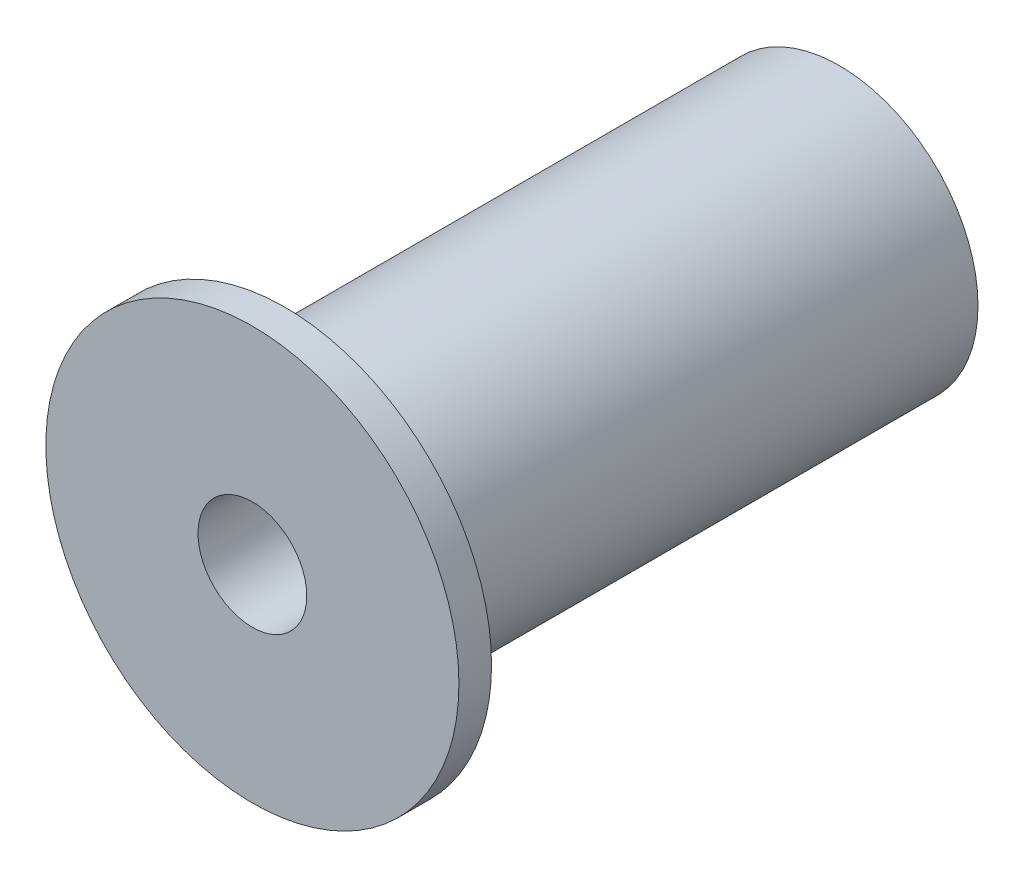
ISO-10303-21;
HEADER;
FILE_DESCRIPTION(('STEP AP214'),'2;1');
FILE_NAME('part.step','',(''),(''),'','','');
FILE_SCHEMA(('AUTOMOTIVE_DESIGN { 1 0 10303 214 1 1 1 1 }'));
ENDSEC;
DATA;
#1=APPLICATION_CONTEXT('core data for automotive mechanical design processes');
#2=APPLICATION_PROTOCOL_DEFINITION('international standard','automotive_design',2000,#1);
#3=PRODUCT_CONTEXT('',#1,'mechanical');
#4=PRODUCT('Part','Part','',(#3));
#5=PRODUCT_RELATED_PRODUCT_CATEGORY('part','',(#4));
#6=PRODUCT_DEFINITION_FORMATION('','',#4);
#7=PRODUCT_DEFINITION_CONTEXT('part definition',#1,'design');
#8=PRODUCT_DEFINITION('design','',#6,#7);
#9=PRODUCT_DEFINITION_SHAPE('','',#8);
#10=(LENGTH_UNIT() NAMED_UNIT(*) SI_UNIT(.MILLI.,.METRE.));
#11=(NAMED_UNIT(*) PLANE_ANGLE_UNIT() SI_UNIT($,.RADIAN.));
#12=(NAMED_UNIT(*) SI_UNIT($,.STERADIAN.) SOLID_ANGLE_UNIT());
#13=UNCERTAINTY_MEASURE_WITH_UNIT(LENGTH_MEASURE(1.E-05),#10,'distance_accuracy_value','');
#14=(GEOMETRIC_REPRESENTATION_CONTEXT(3) GLOBAL_UNCERTAINTY_ASSIGNED_CONTEXT((#13)) GLOBAL_UNIT_ASSIGNED_CONTEXT((#10,
#11,#12)) REPRESENTATION_CONTEXT('',''));
#15=CARTESIAN_POINT('',(0.,0.,0.));
#16=DIRECTION('',(0.,0.,1.));
#17=DIRECTION('',(1.,0.,0.));
#18=AXIS2_PLACEMENT_3D('',#15,#16,#17);
#19=CARTESIAN_POINT('',(0.,0.,0.));
#20=DIRECTION('',(0.,0.,1.));
#21=DIRECTION('',(1.,0.,0.));
#22=AXIS2_PLACEMENT_3D('',#19,#20,#21);
#23=PLANE('',#22);
#24=CARTESIAN_POINT('',(0.,0.,0.));
#25=DIRECTION('',(0.,0.,1.));
#26=DIRECTION('',(1.,0.,0.));
#27=AXIS2_PLACEMENT_3D('',#24,#25,#26);
#28=CIRCLE('',#27,9.5);
#29=CARTESIAN_POINT('',(9.5,0.,0.));
#30=VERTEX_POINT('',#29);
#31=EDGE_CURVE('E49',#30,#30,#28,.T.);
#32=ORIENTED_EDGE('',*,*,#31,.F.);
#33=EDGE_LOOP('',(#32));
#34=FACE_BOUND('',#33,.T.);
#35=CARTESIAN_POINT('',(0.,0.,0.));
#36=DIRECTION('',(0.,0.,1.));
#37=DIRECTION('',(1.,0.,0.));
#38=AXIS2_PLACEMENT_3D('',#35,#36,#37);
#39=CIRCLE('',#38,6.375);
#40=CARTESIAN_POINT('',(6.375,0.,0.));
#41=VERTEX_POINT('',#40);
#42=EDGE_CURVE('E42',#41,#41,#39,.F.);
#43=ORIENTED_EDGE('',*,*,#42,.F.);
#44=EDGE_LOOP('',(#43));
#45=FACE_BOUND('',#44,.T.);
#46=ADVANCED_FACE('F31',(#34,#45),#23,.F.);
#47=CARTESIAN_POINT('',(0.,0.,1.5));
#48=DIRECTION('',(0.,0.,-1.));
#49=DIRECTION('',(-1.,0.,0.));
#50=AXIS2_PLACEMENT_3D('',#47,#48,#49);
#51=CYLINDRICAL_SURFACE('',#50,9.5);
#52=CARTESIAN_POINT('',(0.,0.,1.5));
#53=DIRECTION('',(0.,0.,1.));
#54=DIRECTION('',(1.,0.,0.));
#55=AXIS2_PLACEMENT_3D('',#52,#53,#54);
#56=CIRCLE('',#55,9.5);
#57=CARTESIAN_POINT('',(9.5,0.,1.5));
#58=VERTEX_POINT('',#57);
#59=EDGE_CURVE('E46',#58,#58,#56,.T.);
#60=ORIENTED_EDGE('',*,*,#59,.F.);
#61=EDGE_LOOP('',(#60));
#62=FACE_BOUND('',#61,.T.);
#63=ORIENTED_EDGE('',*,*,#31,.T.);
#64=EDGE_LOOP('',(#63));
#65=FACE_BOUND('',#64,.T.);
#66=ADVANCED_FACE('F84',(#62,#65),#51,.T.);
#67=CARTESIAN_POINT('',(0.,0.,1.5));
#68=DIRECTION('',(0.,0.,1.));
#69=DIRECTION('',(1.,0.,0.));
#70=AXIS2_PLACEMENT_3D('',#67,#68,#69);
#71=PLANE('',#70);
#72=CARTESIAN_POINT('',(0.,0.,1.5));
#73=DIRECTION('',(0.,0.,1.));
#74=DIRECTION('',(1.,0.,0.));
#75=AXIS2_PLACEMENT_3D('',#72,#73,#74);
#76=CIRCLE('',#75,2.5);
#77=CARTESIAN_POINT('',(2.5,0.,1.5));
#78=VERTEX_POINT('',#77);
#79=EDGE_CURVE('E58',#78,#78,#76,.T.);
#80=ORIENTED_EDGE('',*,*,#79,.F.);
#81=EDGE_LOOP('',(#80));
#82=FACE_BOUND('',#81,.T.);
#83=ORIENTED_EDGE('',*,*,#59,.T.);
#84=EDGE_LOOP('',(#83));
#85=FACE_BOUND('',#84,.T.);
#86=ADVANCED_FACE('F79',(#82,#85),#71,.T.);
#87=CARTESIAN_POINT('',(0.,0.,-25.5));
#88=DIRECTION('',(0.,0.,1.));
#89=DIRECTION('',(1.,0.,0.));
#90=AXIS2_PLACEMENT_3D('',#87,#88,#89);
#91=CYLINDRICAL_SURFACE('',#90,6.375);
#92=CARTESIAN_POINT('',(0.,0.,-25.5));
#93=DIRECTION('',(0.,0.,-1.));
#94=DIRECTION('',(-1.,0.,0.));
#95=AXIS2_PLACEMENT_3D('',#92,#93,#94);
#96=CIRCLE('',#95,6.375);
#97=CARTESIAN_POINT('',(-6.375,0.,-25.5));
#98=VERTEX_POINT('',#97);
#99=EDGE_CURVE('E52',#98,#98,#96,.T.);
#100=ORIENTED_EDGE('',*,*,#99,.F.);
#101=EDGE_LOOP('',(#100));
#102=FACE_BOUND('',#101,.T.);
#103=ORIENTED_EDGE('',*,*,#42,.T.);
#104=EDGE_LOOP('',(#103));
#105=FACE_BOUND('',#104,.T.);
#106=ADVANCED_FACE('F73',(#102,#105),#91,.T.);
#107=CARTESIAN_POINT('',(0.,0.,-25.5));
#108=DIRECTION('',(0.,0.,-1.));
#109=DIRECTION('',(-1.,0.,0.));
#110=AXIS2_PLACEMENT_3D('',#107,#108,#109);
#111=PLANE('',#110);
#112=CARTESIAN_POINT('',(0.,0.,-25.5));
#113=DIRECTION('',(0.,0.,-1.));
#114=DIRECTION('',(-1.,0.,0.));
#115=AXIS2_PLACEMENT_3D('',#112,#113,#114);
#116=CIRCLE('',#115,1.5);
#117=CARTESIAN_POINT('',(-1.5,0.,-25.5));
#118=VERTEX_POINT('',#117);
#119=EDGE_CURVE('E61',#118,#118,#116,.T.);
#120=ORIENTED_EDGE('',*,*,#119,.F.);
#121=EDGE_LOOP('',(#120));
#122=FACE_BOUND('',#121,.T.);
#123=ORIENTED_EDGE('',*,*,#99,.T.);
#124=EDGE_LOOP('',(#123));
#125=FACE_BOUND('',#124,.T.);
#126=ADVANCED_FACE('F69',(#122,#125),#111,.T.);
#127=CARTESIAN_POINT('',(0.,0.,-11.5));
#128=DIRECTION('',(0.,0.,1.));
#129=DIRECTION('',(1.,0.,0.));
#130=AXIS2_PLACEMENT_3D('',#127,#128,#129);
#131=CYLINDRICAL_SURFACE('',#130,2.5);
#132=CARTESIAN_POINT('',(0.,0.,-11.5));
#133=DIRECTION('',(0.,0.,1.));
#134=DIRECTION('',(1.,0.,0.));
#135=AXIS2_PLACEMENT_3D('',#132,#133,#134);
#136=CIRCLE('',#135,2.5);
#137=CARTESIAN_POINT('',(2.5,0.,-11.5));
#138=VERTEX_POINT('',#137);
#139=EDGE_CURVE('E57',#138,#138,#136,.T.);
#140=CARTESIAN_POINT('',(2.5,0.,-11.5));
#141=CARTESIAN_POINT('',(2.5,0.,-11.3645833333333));
#142=CARTESIAN_POINT('',(2.5,0.,-11.2291666666667));
#143=CARTESIAN_POINT('',(2.5,0.,-10.9583333333333));
#144=CARTESIAN_POINT('',(2.5,0.,-10.8229166666667));
#145=CARTESIAN_POINT('',(2.5,0.,-10.5520833333333));
#146=CARTESIAN_POINT('',(2.5,0.,-10.4166666666667));
#147=CARTESIAN_POINT('',(2.5,0.,-10.1458333333333));
#148=CARTESIAN_POINT('',(2.5,0.,-10.0104166666667));
#149=CARTESIAN_POINT('',(2.5,0.,-9.73958333333333));
#150=CARTESIAN_POINT('',(2.5,0.,-9.60416666666667));
#151=CARTESIAN_POINT('',(2.5,0.,-9.33333333333333));
#152=CARTESIAN_POINT('',(2.5,0.,-9.19791666666667));
#153=CARTESIAN_POINT('',(2.5,0.,-8.92708333333333));
#154=CARTESIAN_POINT('',(2.5,0.,-8.79166666666667));
#155=CARTESIAN_POINT('',(2.5,0.,-8.52083333333333));
#156=CARTESIAN_POINT('',(2.5,0.,-8.38541666666667));
#157=CARTESIAN_POINT('',(2.5,0.,-8.11458333333333));
#158=CARTESIAN_POINT('',(2.5,0.,-7.97916666666667));
#159=CARTESIAN_POINT('',(2.5,0.,-7.70833333333333));
#160=CARTESIAN_POINT('',(2.5,0.,-7.57291666666667));
#161=CARTESIAN_POINT('',(2.5,0.,-7.30208333333333));
#162=CARTESIAN_POINT('',(2.5,0.,-7.16666666666667));
#163=CARTESIAN_POINT('',(2.5,0.,-6.89583333333333));
#164=CARTESIAN_POINT('',(2.5,0.,-6.76041666666667));
#165=CARTESIAN_POINT('',(2.5,0.,-6.48958333333333));
#166=CARTESIAN_POINT('',(2.5,0.,-6.35416666666667));
#167=CARTESIAN_POINT('',(2.5,0.,-6.08333333333333));
#168=CARTESIAN_POINT('',(2.5,0.,-5.94791666666667));
#169=CARTESIAN_POINT('',(2.5,0.,-5.67708333333333));
#170=CARTESIAN_POINT('',(2.5,0.,-5.54166666666667));
#171=CARTESIAN_POINT('',(2.5,0.,-5.27083333333333));
#172=CARTESIAN_POINT('',(2.5,0.,-5.13541666666667));
#173=CARTESIAN_POINT('',(2.5,0.,-4.86458333333333));
#174=CARTESIAN_POINT('',(2.5,0.,-4.72916666666667));
#175=CARTESIAN_POINT('',(2.5,0.,-4.45833333333333));
#176=CARTESIAN_POINT('',(2.5,0.,-4.32291666666667));
#177=CARTESIAN_POINT('',(2.5,0.,-4.05208333333333));
#178=CARTESIAN_POINT('',(2.5,0.,-3.91666666666667));
#179=CARTESIAN_POINT('',(2.5,0.,-3.64583333333333));
#180=CARTESIAN_POINT('',(2.5,0.,-3.51041666666667));
#181=CARTESIAN_POINT('',(2.5,0.,-3.23958333333333));
#182=CARTESIAN_POINT('',(2.5,0.,-3.10416666666667));
#183=CARTESIAN_POINT('',(2.5,0.,-2.83333333333333));
#184=CARTESIAN_POINT('',(2.5,0.,-2.69791666666667));
#185=CARTESIAN_POINT('',(2.5,0.,-2.42708333333333));
#186=CARTESIAN_POINT('',(2.5,0.,-2.29166666666667));
#187=CARTESIAN_POINT('',(2.5,0.,-2.02083333333333));
#188=CARTESIAN_POINT('',(2.5,0.,-1.88541666666667));
#189=CARTESIAN_POINT('',(2.5,0.,-1.61458333333333));
#190=CARTESIAN_POINT('',(2.5,0.,-1.47916666666667));
#191=CARTESIAN_POINT('',(2.5,0.,-1.20833333333333));
#192=CARTESIAN_POINT('',(2.5,0.,-1.07291666666667));
#193=CARTESIAN_POINT('',(2.5,0.,-0.802083333333334));
#194=CARTESIAN_POINT('',(2.5,0.,-0.666666666666667));
#195=CARTESIAN_POINT('',(2.5,0.,-0.395833333333334));
#196=CARTESIAN_POINT('',(2.5,0.,-0.260416666666667));
#197=CARTESIAN_POINT('',(2.5,0.,0.0104166666666667));
#198=CARTESIAN_POINT('',(2.5,0.,0.145833333333333));
#199=CARTESIAN_POINT('',(2.5,0.,0.416666666666666));
#200=CARTESIAN_POINT('',(2.5,0.,0.552083333333333));
#201=CARTESIAN_POINT('',(2.5,0.,0.822916666666666));
#202=CARTESIAN_POINT('',(2.5,0.,0.958333333333332));
#203=CARTESIAN_POINT('',(2.5,0.,1.22916666666667));
#204=CARTESIAN_POINT('',(2.5,0.,1.36458333333333));
#205=CARTESIAN_POINT('',(2.5,0.,1.5));
#206=B_SPLINE_CURVE_WITH_KNOTS('',3,(#140,#141,#142,#143,#144,#145,#146,#147,#148,#149,#150,
#151,#152,#153,#154,#155,#156,#157,#158,#159,#160,#161,#162,#163,#164,#165,#166,#167,#168,#169,
#170,#171,#172,#173,#174,#175,#176,#177,#178,#179,#180,#181,#182,#183,#184,#185,#186,#187,#188,
#189,#190,#191,#192,#193,#194,#195,#196,#197,#198,#199,#200,#201,#202,#203,#204,#205),
.UNSPECIFIED.,.F.,.F.,(4,2,2,2,2,2,2,2,2,2,2,2,2,2,2,2,2,2,2,2,2,2,2,2,2,2,2,2,2,2,2,2,4),(0.,
0.406249999999999,0.812499999999999,1.21875,1.625,2.03125,2.4375,2.84375,3.25,3.65625,4.0625,
4.46875,4.875,5.28125,5.6875,6.09375,6.5,6.90625,7.3125,7.71875,8.125,8.53125,8.9375,9.34375,
9.75,10.15625,10.5625,10.96875,11.375,11.78125,12.1875,12.59375,13.),.UNSPECIFIED.);
#207=EDGE_CURVE('BSEAM72',#138,#78,#206,.T.);
#208=ORIENTED_EDGE('',*,*,#139,.F.);
#209=ORIENTED_EDGE('',*,*,#79,.T.);
#210=ORIENTED_EDGE('',*,*,#207,.T.);
#211=ORIENTED_EDGE('',*,*,#207,.F.);
#212=EDGE_LOOP('',(#208,#210,#209,#211));
#213=FACE_BOUND('',#212,.T.);
#214=ADVANCED_FACE('F72',(#213),#131,.F.);
#215=CARTESIAN_POINT('',(0.,0.,-11.5));
#216=DIRECTION('',(0.,0.,1.));
#217=DIRECTION('',(1.,0.,0.));
#218=AXIS2_PLACEMENT_3D('',#215,#216,#217);
#219=PLANE('',#218);
#220=CARTESIAN_POINT('',(0.,0.,-11.5));
#221=DIRECTION('',(0.,0.,1.));
#222=DIRECTION('',(1.,0.,0.));
#223=AXIS2_PLACEMENT_3D('',#220,#221,#222);
#224=CIRCLE('',#223,2.285);
#225=CARTESIAN_POINT('',(2.285,0.,-11.5));
#226=VERTEX_POINT('',#225);
#227=EDGE_CURVE('E10',#226,#226,#224,.F.);
#228=ORIENTED_EDGE('',*,*,#227,.T.);
#229=EDGE_LOOP('',(#228));
#230=FACE_BOUND('',#229,.T.);
#231=ORIENTED_EDGE('',*,*,#139,.T.);
#232=EDGE_LOOP('',(#231));
#233=FACE_BOUND('',#232,.T.);
#234=ADVANCED_FACE('F98',(#230,#233),#219,.T.);
#235=CARTESIAN_POINT('',(0.,0.,11.7948662820083));
#236=DIRECTION('',(0.,0.,-1.));
#237=DIRECTION('',(-1.,0.,0.));
#238=AXIS2_PLACEMENT_3D('',#235,#236,#237);
#239=CYLINDRICAL_SURFACE('',#238,1.5);
#240=CARTESIAN_POINT('',(0.,0.,-12.285));
#241=DIRECTION('',(0.,0.,1.));
#242=DIRECTION('',(1.,0.,0.));
#243=AXIS2_PLACEMENT_3D('',#240,#241,#242);
#244=CIRCLE('',#243,1.5);
#245=CARTESIAN_POINT('',(1.5,0.,-12.285));
#246=VERTEX_POINT('',#245);
#247=EDGE_CURVE('E38',#246,#246,#244,.T.);
#248=ORIENTED_EDGE('',*,*,#247,.T.);
#249=EDGE_LOOP('',(#248));
#250=FACE_BOUND('',#249,.T.);
#251=ORIENTED_EDGE('',*,*,#119,.T.);
#252=EDGE_LOOP('',(#251));
#253=FACE_BOUND('',#252,.T.);
#254=ADVANCED_FACE('F67',(#250,#253),#239,.F.);
#255=CARTESIAN_POINT('',(0.,0.,-12.285));
#256=DIRECTION('',(0.,0.,1.));
#257=DIRECTION('',(1.,0.,0.));
#258=AXIS2_PLACEMENT_3D('',#255,#256,#257);
#259=CONICAL_SURFACE('',#258,1.5,0.785398163397449);
#260=CARTESIAN_POINT('',(2.285,0.,-11.5));
#261=CARTESIAN_POINT('',(2.27682291666666,0.,-11.5081770833333));
#262=CARTESIAN_POINT('',(2.26864583333333,0.,-11.5163541666667));
#263=CARTESIAN_POINT('',(2.25229166666666,0.,-11.5327083333333));
#264=CARTESIAN_POINT('',(2.24411458333333,0.,-11.5408854166667));
#265=CARTESIAN_POINT('',(2.22776041666666,0.,-11.5572395833333));
#266=CARTESIAN_POINT('',(2.21958333333333,0.,-11.5654166666667));
#267=CARTESIAN_POINT('',(2.20322916666666,0.,-11.5817708333333));
#268=CARTESIAN_POINT('',(2.19505208333333,0.,-11.5899479166667));
#269=CARTESIAN_POINT('',(2.17869791666666,0.,-11.6063020833333));
#270=CARTESIAN_POINT('',(2.17052083333333,0.,-11.6144791666667));
#271=CARTESIAN_POINT('',(2.15416666666666,0.,-11.6308333333333));
#272=CARTESIAN_POINT('',(2.14598958333333,0.,-11.6390104166667));
#273=CARTESIAN_POINT('',(2.12963541666666,0.,-11.6553645833333));
#274=CARTESIAN_POINT('',(2.12145833333333,0.,-11.6635416666667));
#275=CARTESIAN_POINT('',(2.10510416666667,0.,-11.6798958333333));
#276=CARTESIAN_POINT('',(2.09692708333333,0.,-11.6880729166667));
#277=CARTESIAN_POINT('',(2.08057291666666,0.,-11.7044270833333));
#278=CARTESIAN_POINT('',(2.07239583333333,0.,-11.7126041666667));
#279=CARTESIAN_POINT('',(2.05604166666667,0.,-11.7289583333333));
#280=CARTESIAN_POINT('',(2.04786458333333,0.,-11.7371354166667));
#281=CARTESIAN_POINT('',(2.03151041666667,0.,-11.7534895833333));
#282=CARTESIAN_POINT('',(2.02333333333333,0.,-11.7616666666667));
#283=CARTESIAN_POINT('',(2.00697916666666,0.,-11.7780208333333));
#284=CARTESIAN_POINT('',(1.99880208333333,0.,-11.7861979166667));
#285=CARTESIAN_POINT('',(1.98244791666666,0.,-11.8025520833333));
#286=CARTESIAN_POINT('',(1.97427083333333,0.,-11.8107291666667));
#287=CARTESIAN_POINT('',(1.95791666666667,0.,-11.8270833333333));
#288=CARTESIAN_POINT('',(1.94973958333333,0.,-11.8352604166667));
#289=CARTESIAN_POINT('',(1.93338541666667,0.,-11.8516145833333));
#290=CARTESIAN_POINT('',(1.92520833333333,0.,-11.8597916666667));
#291=CARTESIAN_POINT('',(1.90885416666667,0.,-11.8761458333333));
#292=CARTESIAN_POINT('',(1.90067708333333,0.,-11.8843229166667));
#293=CARTESIAN_POINT('',(1.88432291666667,0.,-11.9006770833333));
#294=CARTESIAN_POINT('',(1.87614583333333,0.,-11.9088541666667));
#295=CARTESIAN_POINT('',(1.85979166666667,0.,-11.9252083333333));
#296=CARTESIAN_POINT('',(1.85161458333333,0.,-11.9333854166667));
#297=CARTESIAN_POINT('',(1.83526041666667,0.,-11.9497395833333));
#298=CARTESIAN_POINT('',(1.82708333333333,0.,-11.9579166666667));
#299=CARTESIAN_POINT('',(1.81072916666667,0.,-11.9742708333333));
#300=CARTESIAN_POINT('',(1.80255208333333,0.,-11.9824479166667));
#301=CARTESIAN_POINT('',(1.78619791666667,0.,-11.9988020833333));
#302=CARTESIAN_POINT('',(1.77802083333333,0.,-12.0069791666667));
#303=CARTESIAN_POINT('',(1.76166666666667,0.,-12.0233333333333));
#304=CARTESIAN_POINT('',(1.75348958333333,0.,-12.0315104166667));
#305=CARTESIAN_POINT('',(1.73713541666667,0.,-12.0478645833333));
#306=CARTESIAN_POINT('',(1.72895833333333,0.,-12.0560416666667));
#307=CARTESIAN_POINT('',(1.71260416666667,0.,-12.0723958333333));
#308=CARTESIAN_POINT('',(1.70442708333333,0.,-12.0805729166667));
#309=CARTESIAN_POINT('',(1.68807291666667,0.,-12.0969270833333));
#310=CARTESIAN_POINT('',(1.67989583333333,0.,-12.1051041666667));
#311=CARTESIAN_POINT('',(1.66354166666667,0.,-12.1214583333333));
#312=CARTESIAN_POINT('',(1.65536458333333,0.,-12.1296354166667));
#313=CARTESIAN_POINT('',(1.63901041666667,0.,-12.1459895833333));
#314=CARTESIAN_POINT('',(1.63083333333333,0.,-12.1541666666667));
#315=CARTESIAN_POINT('',(1.61447916666667,0.,-12.1705208333333));
#316=CARTESIAN_POINT('',(1.60630208333333,0.,-12.1786979166667));
#317=CARTESIAN_POINT('',(1.58994791666667,0.,-12.1950520833333));
#318=CARTESIAN_POINT('',(1.58177083333333,0.,-12.2032291666667));
#319=CARTESIAN_POINT('',(1.56541666666667,0.,-12.2195833333333));
#320=CARTESIAN_POINT('',(1.55723958333333,0.,-12.2277604166667));
#321=CARTESIAN_POINT('',(1.54088541666667,0.,-12.2441145833333));
#322=CARTESIAN_POINT('',(1.53270833333333,0.,-12.2522916666667));
#323=CARTESIAN_POINT('',(1.51635416666667,0.,-12.2686458333333));
#324=CARTESIAN_POINT('',(1.50817708333333,0.,-12.2768229166667));
#325=CARTESIAN_POINT('',(1.5,0.,-12.285));
#326=B_SPLINE_CURVE_WITH_KNOTS('',3,(#260,#261,#262,#263,#264,#265,#266,#267,#268,#269,#270,
#271,#272,#273,#274,#275,#276,#277,#278,#279,#280,#281,#282,#283,#284,#285,#286,#287,#288,#289,
#290,#291,#292,#293,#294,#295,#296,#297,#298,#299,#300,#301,#302,#303,#304,#305,#306,#307,#308,
#309,#310,#311,#312,#313,#314,#315,#316,#317,#318,#319,#320,#321,#322,#323,#324,#325),
.UNSPECIFIED.,.F.,.F.,(4,2,2,2,2,2,2,2,2,2,2,2,2,2,2,2,2,2,2,2,2,2,2,2,2,2,2,2,2,2,2,2,4),(0.,
0.0346924264519647,0.0693848529039292,0.104077279355894,0.13876970580786,0.173462132259824,
0.208154558711788,0.242846985163754,0.277539411615719,0.312231838067683,0.346924264519649,
0.381616690971613,0.416309117423578,0.451001543875544,0.485693970327508,0.520386396779473,
0.555078823231438,0.589771249683403,0.624463676135368,0.659156102587332,0.693848529039298,
0.728540955491262,0.763233381943227,0.797925808395193,0.832618234847157,0.867310661299122,
0.902003087751087,0.936695514203052,0.971387940655016,1.00608036710698,1.04077279355895,
1.07546522001091,1.11015764646288),.UNSPECIFIED.);
#327=EDGE_CURVE('BSEAM33',#226,#246,#326,.T.);
#328=ORIENTED_EDGE('',*,*,#227,.F.);
#329=ORIENTED_EDGE('',*,*,#247,.F.);
#330=ORIENTED_EDGE('',*,*,#327,.T.);
#331=ORIENTED_EDGE('',*,*,#327,.F.);
#332=EDGE_LOOP('',(#328,#330,#329,#331));
#333=FACE_BOUND('',#332,.T.);
#334=ADVANCED_FACE('F33',(#333),#259,.F.);
#335=CLOSED_SHELL('',(#46,#66,#86,#106,#126,#214,#234,#254,#334));
#336=MANIFOLD_SOLID_BREP('B2',#335);
#337=ADVANCED_BREP_SHAPE_REPRESENTATION('',(#18,#336),#14);
#338=SHAPE_DEFINITION_REPRESENTATION(#9,#337);
ENDSEC;
END-ISO-10303-21;
